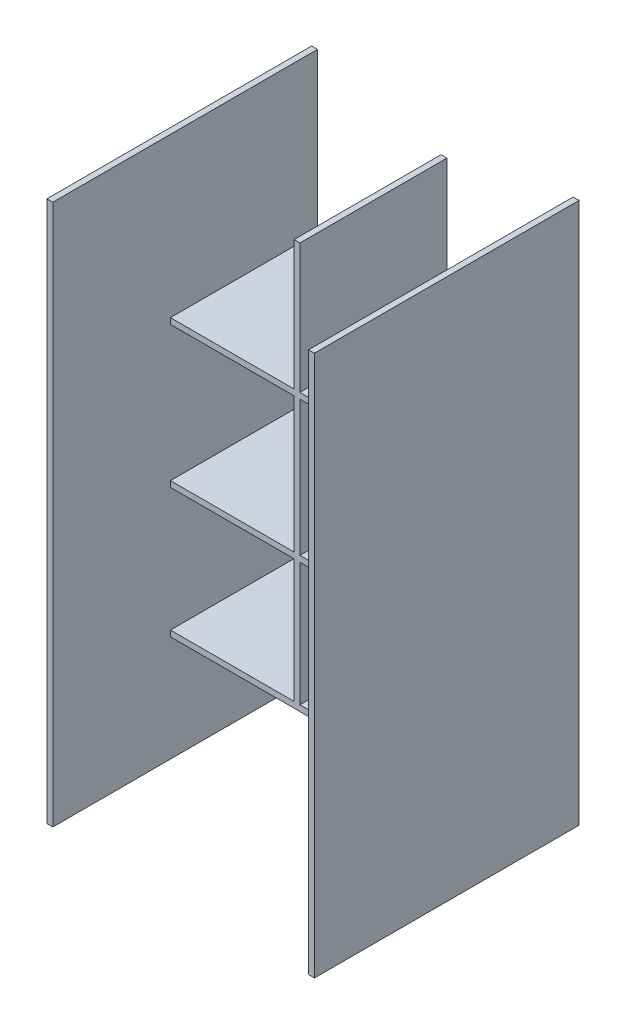
ISO-10303-21;
HEADER;
FILE_DESCRIPTION(('STEP AP214'),'2;1');
FILE_NAME('part.step','',(''),(''),'','','');
FILE_SCHEMA(('AUTOMOTIVE_DESIGN { 1 0 10303 214 1 1 1 1 }'));
ENDSEC;
DATA;
#1=APPLICATION_CONTEXT('core data for automotive mechanical design processes');
#2=APPLICATION_PROTOCOL_DEFINITION('international standard','automotive_design',2000,#1);
#3=PRODUCT_CONTEXT('',#1,'mechanical');
#4=PRODUCT('Part','Part','',(#3));
#5=PRODUCT_RELATED_PRODUCT_CATEGORY('part','',(#4));
#6=PRODUCT_DEFINITION_FORMATION('','',#4);
#7=PRODUCT_DEFINITION_CONTEXT('part definition',#1,'design');
#8=PRODUCT_DEFINITION('design','',#6,#7);
#9=PRODUCT_DEFINITION_SHAPE('','',#8);
#10=(LENGTH_UNIT() NAMED_UNIT(*) SI_UNIT(.MILLI.,.METRE.));
#11=(NAMED_UNIT(*) PLANE_ANGLE_UNIT() SI_UNIT($,.RADIAN.));
#12=(NAMED_UNIT(*) SI_UNIT($,.STERADIAN.) SOLID_ANGLE_UNIT());
#13=UNCERTAINTY_MEASURE_WITH_UNIT(LENGTH_MEASURE(1.E-05),#10,'distance_accuracy_value','');
#14=(GEOMETRIC_REPRESENTATION_CONTEXT(3) GLOBAL_UNCERTAINTY_ASSIGNED_CONTEXT((#13)) GLOBAL_UNIT_ASSIGNED_CONTEXT((#10,
#11,#12)) REPRESENTATION_CONTEXT('',''));
#15=CARTESIAN_POINT('',(0.,0.,0.));
#16=DIRECTION('',(0.,0.,1.));
#17=DIRECTION('',(1.,0.,0.));
#18=AXIS2_PLACEMENT_3D('',#15,#16,#17);
#19=CARTESIAN_POINT('',(250.,-345.,-350.));
#20=DIRECTION('',(0.,-1.,0.));
#21=DIRECTION('',(1.,0.,0.));
#22=AXIS2_PLACEMENT_3D('',#19,#20,#21);
#23=PLANE('',#22);
#24=DIRECTION('',(0.,0.,-1.));
#25=VECTOR('',#24,1.);
#26=CARTESIAN_POINT('',(219.654533205226,-345.,-350.));
#27=LINE('',#26,#25);
#28=CARTESIAN_POINT('',(219.654533205226,-345.,-100.));
#29=VERTEX_POINT('',#28);
#30=CARTESIAN_POINT('',(219.654533205226,-345.,-350.));
#31=VERTEX_POINT('',#30);
#32=EDGE_CURVE('E11',#29,#31,#27,.T.);
#33=ORIENTED_EDGE('',*,*,#32,.F.);
#34=DIRECTION('',(-1.,0.,0.));
#35=VECTOR('',#34,1.);
#36=CARTESIAN_POINT('',(250.,-345.,-100.));
#37=LINE('',#36,#35);
#38=CARTESIAN_POINT('',(-215.088836720033,-345.,-100.));
#39=VERTEX_POINT('',#38);
#40=EDGE_CURVE('E411',#29,#39,#37,.T.);
#41=ORIENTED_EDGE('',*,*,#40,.T.);
#42=DIRECTION('',(0.,0.,1.));
#43=VECTOR('',#42,1.);
#44=CARTESIAN_POINT('',(-215.088836720033,-345.,-350.));
#45=LINE('',#44,#43);
#46=CARTESIAN_POINT('',(-215.088836720033,-345.,-350.));
#47=VERTEX_POINT('',#46);
#48=EDGE_CURVE('E54',#47,#39,#45,.T.);
#49=ORIENTED_EDGE('',*,*,#48,.F.);
#50=DIRECTION('',(1.,0.,0.));
#51=VECTOR('',#50,1.);
#52=CARTESIAN_POINT('',(250.,-345.,-350.));
#53=LINE('',#52,#51);
#54=EDGE_CURVE('E501',#47,#31,#53,.T.);
#55=ORIENTED_EDGE('',*,*,#54,.T.);
#56=EDGE_LOOP('',(#33,#41,#49,#55));
#57=FACE_BOUND('',#56,.T.);
#58=ADVANCED_FACE('F41',(#57),#23,.T.);
#59=CARTESIAN_POINT('',(0.,0.,-350.));
#60=DIRECTION('',(0.,0.,1.));
#61=DIRECTION('',(1.,0.,0.));
#62=AXIS2_PLACEMENT_3D('',#59,#60,#61);
#63=PLANE('',#62);
#64=DIRECTION('',(1.,0.,0.));
#65=VECTOR('',#64,1.);
#66=CARTESIAN_POINT('',(-1.51806005407929E-13,-335.,-350.));
#67=LINE('',#66,#65);
#68=CARTESIAN_POINT('',(5.,-335.,-350.));
#69=VERTEX_POINT('',#68);
#70=CARTESIAN_POINT('',(219.654533205226,-335.,-350.));
#71=VERTEX_POINT('',#70);
#72=EDGE_CURVE('E435',#69,#71,#67,.T.);
#73=ORIENTED_EDGE('',*,*,#72,.T.);
#74=DIRECTION('',(0.,-1.,0.));
#75=VECTOR('',#74,1.);
#76=CARTESIAN_POINT('',(219.654533205226,0.,-350.));
#77=LINE('',#76,#75);
#78=CARTESIAN_POINT('',(219.654533205226,-125.,-350.));
#79=VERTEX_POINT('',#78);
#80=EDGE_CURVE('E341',#79,#71,#77,.T.);
#81=ORIENTED_EDGE('',*,*,#80,.F.);
#82=DIRECTION('',(1.,0.,0.));
#83=VECTOR('',#82,1.);
#84=CARTESIAN_POINT('',(0.,-125.,-350.));
#85=LINE('',#84,#83);
#86=CARTESIAN_POINT('',(5.00000000000001,-125.,-350.));
#87=VERTEX_POINT('',#86);
#88=EDGE_CURVE('E419',#87,#79,#85,.T.);
#89=ORIENTED_EDGE('',*,*,#88,.F.);
#90=DIRECTION('',(0.,1.,0.));
#91=VECTOR('',#90,1.);
#92=CARTESIAN_POINT('',(5.00000000000001,0.,-350.));
#93=LINE('',#92,#91);
#94=EDGE_CURVE('E427',#69,#87,#93,.T.);
#95=ORIENTED_EDGE('',*,*,#94,.F.);
#96=EDGE_LOOP('',(#73,#81,#89,#95));
#97=FACE_BOUND('',#96,.T.);
#98=DIRECTION('',(1.,0.,0.));
#99=VECTOR('',#98,1.);
#100=CARTESIAN_POINT('',(0.,-115.,-350.));
#101=LINE('',#100,#99);
#102=CARTESIAN_POINT('',(5.00000000000001,-115.,-350.));
#103=VERTEX_POINT('',#102);
#104=CARTESIAN_POINT('',(219.654533205226,-115.,-350.));
#105=VERTEX_POINT('',#104);
#106=EDGE_CURVE('E443',#103,#105,#101,.T.);
#107=ORIENTED_EDGE('',*,*,#106,.T.);
#108=DIRECTION('',(0.,-1.,0.));
#109=VECTOR('',#108,1.);
#110=CARTESIAN_POINT('',(219.654533205226,0.,-350.));
#111=LINE('',#110,#109);
#112=CARTESIAN_POINT('',(219.654533205226,115.,-350.));
#113=VERTEX_POINT('',#112);
#114=EDGE_CURVE('E337',#113,#105,#111,.T.);
#115=ORIENTED_EDGE('',*,*,#114,.F.);
#116=DIRECTION('',(1.,0.,0.));
#117=VECTOR('',#116,1.);
#118=CARTESIAN_POINT('',(0.,115.,-350.));
#119=LINE('',#118,#117);
#120=CARTESIAN_POINT('',(5.00000000000002,115.,-350.));
#121=VERTEX_POINT('',#120);
#122=EDGE_CURVE('E449',#121,#113,#119,.T.);
#123=ORIENTED_EDGE('',*,*,#122,.F.);
#124=DIRECTION('',(0.,1.,0.));
#125=VECTOR('',#124,1.);
#126=CARTESIAN_POINT('',(5.00000000000001,0.,-350.));
#127=LINE('',#126,#125);
#128=EDGE_CURVE('E445',#103,#121,#127,.T.);
#129=ORIENTED_EDGE('',*,*,#128,.F.);
#130=EDGE_LOOP('',(#107,#115,#123,#129));
#131=FACE_BOUND('',#130,.T.);
#132=DIRECTION('',(1.,0.,0.));
#133=VECTOR('',#132,1.);
#134=CARTESIAN_POINT('',(0.,115.,-350.));
#135=LINE('',#134,#133);
#136=CARTESIAN_POINT('',(-215.088836720033,115.,-350.));
#137=VERTEX_POINT('',#136);
#138=CARTESIAN_POINT('',(-4.99999999999999,115.,-350.));
#139=VERTEX_POINT('',#138);
#140=EDGE_CURVE('E488',#137,#139,#135,.T.);
#141=ORIENTED_EDGE('',*,*,#140,.F.);
#142=DIRECTION('',(0.,-1.,0.));
#143=VECTOR('',#142,1.);
#144=CARTESIAN_POINT('',(-215.088836720033,-115.,-350.));
#145=LINE('',#144,#143);
#146=CARTESIAN_POINT('',(-215.088836720033,-115.,-350.));
#147=VERTEX_POINT('',#146);
#148=EDGE_CURVE('E351',#137,#147,#145,.T.);
#149=ORIENTED_EDGE('',*,*,#148,.T.);
#150=DIRECTION('',(1.,0.,0.));
#151=VECTOR('',#150,1.);
#152=CARTESIAN_POINT('',(0.,-115.,-350.));
#153=LINE('',#152,#151);
#154=CARTESIAN_POINT('',(-5.,-115.,-350.));
#155=VERTEX_POINT('',#154);
#156=EDGE_CURVE('E453',#147,#155,#153,.T.);
#157=ORIENTED_EDGE('',*,*,#156,.T.);
#158=DIRECTION('',(0.,1.,0.));
#159=VECTOR('',#158,1.);
#160=CARTESIAN_POINT('',(-4.99999999999999,0.,-350.));
#161=LINE('',#160,#159);
#162=EDGE_CURVE('E483',#155,#139,#161,.T.);
#163=ORIENTED_EDGE('',*,*,#162,.T.);
#164=EDGE_LOOP('',(#141,#149,#157,#163));
#165=FACE_BOUND('',#164,.T.);
#166=DIRECTION('',(1.,0.,0.));
#167=VECTOR('',#166,1.);
#168=CARTESIAN_POINT('',(0.,-125.,-350.));
#169=LINE('',#168,#167);
#170=CARTESIAN_POINT('',(-215.088836720033,-125.,-350.));
#171=VERTEX_POINT('',#170);
#172=CARTESIAN_POINT('',(-5.,-125.,-350.));
#173=VERTEX_POINT('',#172);
#174=EDGE_CURVE('E465',#171,#173,#169,.T.);
#175=ORIENTED_EDGE('',*,*,#174,.F.);
#176=DIRECTION('',(0.,-1.,0.));
#177=VECTOR('',#176,1.);
#178=CARTESIAN_POINT('',(-215.088836720033,0.,-350.));
#179=LINE('',#178,#177);
#180=CARTESIAN_POINT('',(-215.088836720033,-335.,-350.));
#181=VERTEX_POINT('',#180);
#182=EDGE_CURVE('E346',#171,#181,#179,.T.);
#183=ORIENTED_EDGE('',*,*,#182,.T.);
#184=DIRECTION('',(1.,0.,0.));
#185=VECTOR('',#184,1.);
#186=CARTESIAN_POINT('',(1.5180600540793E-13,-335.,-350.));
#187=LINE('',#186,#185);
#188=CARTESIAN_POINT('',(-4.99999999999999,-335.,-350.));
#189=VERTEX_POINT('',#188);
#190=EDGE_CURVE('E437',#181,#189,#187,.T.);
#191=ORIENTED_EDGE('',*,*,#190,.T.);
#192=DIRECTION('',(0.,1.,0.));
#193=VECTOR('',#192,1.);
#194=CARTESIAN_POINT('',(-5.,0.,-350.));
#195=LINE('',#194,#193);
#196=EDGE_CURVE('E459',#189,#173,#195,.T.);
#197=ORIENTED_EDGE('',*,*,#196,.T.);
#198=EDGE_LOOP('',(#175,#183,#191,#197));
#199=FACE_BOUND('',#198,.T.);
#200=DIRECTION('',(0.,-1.,0.));
#201=VECTOR('',#200,1.);
#202=CARTESIAN_POINT('',(-215.088836720033,125.,-350.));
#203=LINE('',#202,#201);
#204=CARTESIAN_POINT('',(-215.088836720033,395.,-350.));
#205=VERTEX_POINT('',#204);
#206=CARTESIAN_POINT('',(-215.088836720033,125.,-350.));
#207=VERTEX_POINT('',#206);
#208=EDGE_CURVE('E329',#205,#207,#203,.T.);
#209=ORIENTED_EDGE('',*,*,#208,.T.);
#210=DIRECTION('',(1.,0.,0.));
#211=VECTOR('',#210,1.);
#212=CARTESIAN_POINT('',(0.,125.,-350.));
#213=LINE('',#212,#211);
#214=CARTESIAN_POINT('',(-4.99999999999999,125.,-350.));
#215=VERTEX_POINT('',#214);
#216=EDGE_CURVE('E479',#207,#215,#213,.T.);
#217=ORIENTED_EDGE('',*,*,#216,.T.);
#218=DIRECTION('',(0.,1.,0.));
#219=VECTOR('',#218,1.);
#220=CARTESIAN_POINT('',(-4.99999999999998,0.,-350.));
#221=LINE('',#220,#219);
#222=CARTESIAN_POINT('',(-5.,345.,-350.));
#223=VERTEX_POINT('',#222);
#224=EDGE_CURVE('E494',#215,#223,#221,.T.);
#225=ORIENTED_EDGE('',*,*,#224,.T.);
#226=DIRECTION('',(-1.,0.,0.));
#227=VECTOR('',#226,1.);
#228=CARTESIAN_POINT('',(250.,345.,-350.));
#229=LINE('',#228,#227);
#230=CARTESIAN_POINT('',(5.,345.,-350.));
#231=VERTEX_POINT('',#230);
#232=EDGE_CURVE('E504',#231,#223,#229,.T.);
#233=ORIENTED_EDGE('',*,*,#232,.F.);
#234=DIRECTION('',(0.,1.,0.));
#235=VECTOR('',#234,1.);
#236=CARTESIAN_POINT('',(5.00000000000003,0.,-350.));
#237=LINE('',#236,#235);
#238=CARTESIAN_POINT('',(5.00000000000002,125.,-350.));
#239=VERTEX_POINT('',#238);
#240=EDGE_CURVE('E469',#239,#231,#237,.T.);
#241=ORIENTED_EDGE('',*,*,#240,.F.);
#242=DIRECTION('',(1.,0.,0.));
#243=VECTOR('',#242,1.);
#244=CARTESIAN_POINT('',(0.,125.,-350.));
#245=LINE('',#244,#243);
#246=CARTESIAN_POINT('',(219.654533205226,125.,-350.));
#247=VERTEX_POINT('',#246);
#248=EDGE_CURVE('E472',#239,#247,#245,.T.);
#249=ORIENTED_EDGE('',*,*,#248,.T.);
#250=DIRECTION('',(0.,-1.,0.));
#251=VECTOR('',#250,1.);
#252=CARTESIAN_POINT('',(219.654533205226,-2.91269592349225E-13,-350.));
#253=LINE('',#252,#251);
#254=CARTESIAN_POINT('',(219.654533205226,395.,-350.));
#255=VERTEX_POINT('',#254);
#256=EDGE_CURVE('E368',#255,#247,#253,.T.);
#257=ORIENTED_EDGE('',*,*,#256,.F.);
#258=DIRECTION('',(1.,0.,0.));
#259=VECTOR('',#258,1.);
#260=CARTESIAN_POINT('',(229.654533205226,395.,-350.));
#261=LINE('',#260,#259);
#262=CARTESIAN_POINT('',(229.654533205226,395.,-350.));
#263=VERTEX_POINT('',#262);
#264=EDGE_CURVE('E306',#255,#263,#261,.T.);
#265=ORIENTED_EDGE('',*,*,#264,.T.);
#266=DIRECTION('',(0.,-1.,0.));
#267=VECTOR('',#266,1.);
#268=CARTESIAN_POINT('',(229.654533205226,0.,-350.));
#269=LINE('',#268,#267);
#270=CARTESIAN_POINT('',(229.654533205226,-525.,-350.));
#271=VERTEX_POINT('',#270);
#272=EDGE_CURVE('E344',#263,#271,#269,.T.);
#273=ORIENTED_EDGE('',*,*,#272,.T.);
#274=DIRECTION('',(-1.,0.,0.));
#275=VECTOR('',#274,1.);
#276=CARTESIAN_POINT('',(229.654533205226,-525.,-350.));
#277=LINE('',#276,#275);
#278=CARTESIAN_POINT('',(219.654533205226,-525.,-350.));
#279=VERTEX_POINT('',#278);
#280=EDGE_CURVE('E302',#271,#279,#277,.T.);
#281=ORIENTED_EDGE('',*,*,#280,.T.);
#282=DIRECTION('',(0.,1.,0.));
#283=VECTOR('',#282,1.);
#284=CARTESIAN_POINT('',(219.654533205226,395.,-350.));
#285=LINE('',#284,#283);
#286=EDGE_CURVE('E257',#279,#31,#285,.T.);
#287=ORIENTED_EDGE('',*,*,#286,.T.);
#288=ORIENTED_EDGE('',*,*,#54,.F.);
#289=DIRECTION('',(0.,-1.,0.));
#290=VECTOR('',#289,1.);
#291=CARTESIAN_POINT('',(-215.088836720033,395.,-350.));
#292=LINE('',#291,#290);
#293=CARTESIAN_POINT('',(-215.088836720033,-525.,-350.));
#294=VERTEX_POINT('',#293);
#295=EDGE_CURVE('E321',#47,#294,#292,.T.);
#296=ORIENTED_EDGE('',*,*,#295,.T.);
#297=DIRECTION('',(-1.,0.,0.));
#298=VECTOR('',#297,1.);
#299=CARTESIAN_POINT('',(-225.088836720033,-525.,-350.));
#300=LINE('',#299,#298);
#301=CARTESIAN_POINT('',(-225.088836720033,-525.,-350.));
#302=VERTEX_POINT('',#301);
#303=EDGE_CURVE('E322',#294,#302,#300,.T.);
#304=ORIENTED_EDGE('',*,*,#303,.T.);
#305=DIRECTION('',(0.,-1.,0.));
#306=VECTOR('',#305,1.);
#307=CARTESIAN_POINT('',(-225.088836720033,125.,-350.));
#308=LINE('',#307,#306);
#309=CARTESIAN_POINT('',(-225.088836720033,395.,-350.));
#310=VERTEX_POINT('',#309);
#311=EDGE_CURVE('E362',#310,#302,#308,.T.);
#312=ORIENTED_EDGE('',*,*,#311,.F.);
#313=DIRECTION('',(1.,0.,0.));
#314=VECTOR('',#313,1.);
#315=CARTESIAN_POINT('',(-225.088836720033,395.,-350.));
#316=LINE('',#315,#314);
#317=EDGE_CURVE('E281',#310,#205,#316,.T.);
#318=ORIENTED_EDGE('',*,*,#317,.T.);
#319=EDGE_LOOP('',(#209,#217,#225,#233,#241,#249,#257,#265,#273,#281,#287,#288,#296,#304,#312,#318));
#320=FACE_BOUND('',#319,.T.);
#321=CARTESIAN_POINT('',(0.,-330.,-350.));
#322=DIRECTION('',(0.,0.,-1.));
#323=DIRECTION('',(1.,0.,0.));
#324=AXIS2_PLACEMENT_3D('',#321,#322,#323);
#325=CIRCLE('',#324,2.5);
#326=CARTESIAN_POINT('',(2.5,-330.,-350.));
#327=VERTEX_POINT('',#326);
#328=EDGE_CURVE('E421',#327,#327,#325,.T.);
#329=ORIENTED_EDGE('',*,*,#328,.F.);
#330=EDGE_LOOP('',(#329));
#331=FACE_BOUND('',#330,.T.);
#332=CARTESIAN_POINT('',(0.,330.,-350.));
#333=DIRECTION('',(0.,0.,-1.));
#334=DIRECTION('',(-1.,0.,0.));
#335=AXIS2_PLACEMENT_3D('',#332,#333,#334);
#336=CIRCLE('',#335,2.5);
#337=CARTESIAN_POINT('',(-2.5,330.,-350.));
#338=VERTEX_POINT('',#337);
#339=EDGE_CURVE('E416',#338,#338,#336,.T.);
#340=ORIENTED_EDGE('',*,*,#339,.F.);
#341=EDGE_LOOP('',(#340));
#342=FACE_BOUND('',#341,.T.);
#343=ADVANCED_FACE('F523',(#97,#131,#165,#199,#320,#331,#342),#63,.F.);
#344=CARTESIAN_POINT('',(0.,0.,-100.));
#345=DIRECTION('',(0.,0.,1.));
#346=DIRECTION('',(1.,0.,0.));
#347=AXIS2_PLACEMENT_3D('',#344,#345,#346);
#348=PLANE('',#347);
#349=DIRECTION('',(0.,-1.,0.));
#350=VECTOR('',#349,1.);
#351=CARTESIAN_POINT('',(219.654533205226,395.,-100.));
#352=LINE('',#351,#350);
#353=CARTESIAN_POINT('',(219.654533205226,125.,-100.));
#354=VERTEX_POINT('',#353);
#355=CARTESIAN_POINT('',(219.654533205226,115.,-100.));
#356=VERTEX_POINT('',#355);
#357=EDGE_CURVE('E273',#354,#356,#352,.T.);
#358=ORIENTED_EDGE('',*,*,#357,.F.);
#359=DIRECTION('',(-1.,0.,0.));
#360=VECTOR('',#359,1.);
#361=CARTESIAN_POINT('',(0.,125.,-100.));
#362=LINE('',#361,#360);
#363=CARTESIAN_POINT('',(5.00000000000002,125.,-100.));
#364=VERTEX_POINT('',#363);
#365=EDGE_CURVE('E48',#354,#364,#362,.T.);
#366=ORIENTED_EDGE('',*,*,#365,.T.);
#367=DIRECTION('',(0.,-1.,0.));
#368=VECTOR('',#367,1.);
#369=CARTESIAN_POINT('',(5.00000000000003,0.,-100.));
#370=LINE('',#369,#368);
#371=CARTESIAN_POINT('',(5.,345.,-100.));
#372=VERTEX_POINT('',#371);
#373=EDGE_CURVE('E369',#372,#364,#370,.T.);
#374=ORIENTED_EDGE('',*,*,#373,.F.);
#375=DIRECTION('',(1.,0.,0.));
#376=VECTOR('',#375,1.);
#377=CARTESIAN_POINT('',(250.,345.,-100.));
#378=LINE('',#377,#376);
#379=CARTESIAN_POINT('',(-5.,345.,-100.));
#380=VERTEX_POINT('',#379);
#381=EDGE_CURVE('E374',#380,#372,#378,.T.);
#382=ORIENTED_EDGE('',*,*,#381,.F.);
#383=DIRECTION('',(0.,-1.,0.));
#384=VECTOR('',#383,1.);
#385=CARTESIAN_POINT('',(-4.99999999999998,0.,-100.));
#386=LINE('',#385,#384);
#387=CARTESIAN_POINT('',(-4.99999999999999,125.,-100.));
#388=VERTEX_POINT('',#387);
#389=EDGE_CURVE('E377',#380,#388,#386,.T.);
#390=ORIENTED_EDGE('',*,*,#389,.T.);
#391=DIRECTION('',(-1.,0.,0.));
#392=VECTOR('',#391,1.);
#393=CARTESIAN_POINT('',(0.,125.,-100.));
#394=LINE('',#393,#392);
#395=CARTESIAN_POINT('',(-215.088836720033,125.,-100.));
#396=VERTEX_POINT('',#395);
#397=EDGE_CURVE('E379',#388,#396,#394,.T.);
#398=ORIENTED_EDGE('',*,*,#397,.T.);
#399=DIRECTION('',(0.,1.,0.));
#400=VECTOR('',#399,1.);
#401=CARTESIAN_POINT('',(-215.088836720033,395.,-100.));
#402=LINE('',#401,#400);
#403=CARTESIAN_POINT('',(-215.088836720033,115.,-100.));
#404=VERTEX_POINT('',#403);
#405=EDGE_CURVE('E290',#404,#396,#402,.T.);
#406=ORIENTED_EDGE('',*,*,#405,.F.);
#407=DIRECTION('',(-1.,0.,0.));
#408=VECTOR('',#407,1.);
#409=CARTESIAN_POINT('',(0.,115.,-100.));
#410=LINE('',#409,#408);
#411=CARTESIAN_POINT('',(-4.99999999999999,115.,-100.));
#412=VERTEX_POINT('',#411);
#413=EDGE_CURVE('E401',#412,#404,#410,.T.);
#414=ORIENTED_EDGE('',*,*,#413,.F.);
#415=DIRECTION('',(0.,-1.,0.));
#416=VECTOR('',#415,1.);
#417=CARTESIAN_POINT('',(-4.99999999999999,0.,-100.));
#418=LINE('',#417,#416);
#419=CARTESIAN_POINT('',(-5.,-115.,-100.));
#420=VERTEX_POINT('',#419);
#421=EDGE_CURVE('E402',#412,#420,#418,.T.);
#422=ORIENTED_EDGE('',*,*,#421,.T.);
#423=DIRECTION('',(-1.,0.,0.));
#424=VECTOR('',#423,1.);
#425=CARTESIAN_POINT('',(0.,-115.,-100.));
#426=LINE('',#425,#424);
#427=CARTESIAN_POINT('',(-215.088836720033,-115.,-100.));
#428=VERTEX_POINT('',#427);
#429=EDGE_CURVE('E398',#420,#428,#426,.T.);
#430=ORIENTED_EDGE('',*,*,#429,.T.);
#431=CARTESIAN_POINT('',(-215.088836720033,-125.,-100.));
#432=VERTEX_POINT('',#431);
#433=EDGE_CURVE('E286',#432,#428,#402,.T.);
#434=ORIENTED_EDGE('',*,*,#433,.F.);
#435=DIRECTION('',(-1.,0.,0.));
#436=VECTOR('',#435,1.);
#437=CARTESIAN_POINT('',(0.,-125.,-100.));
#438=LINE('',#437,#436);
#439=CARTESIAN_POINT('',(-5.,-125.,-100.));
#440=VERTEX_POINT('',#439);
#441=EDGE_CURVE('E389',#440,#432,#438,.T.);
#442=ORIENTED_EDGE('',*,*,#441,.F.);
#443=DIRECTION('',(0.,-1.,0.));
#444=VECTOR('',#443,1.);
#445=CARTESIAN_POINT('',(-5.,0.,-100.));
#446=LINE('',#445,#444);
#447=CARTESIAN_POINT('',(-4.99999999999999,-335.,-100.));
#448=VERTEX_POINT('',#447);
#449=EDGE_CURVE('E387',#440,#448,#446,.T.);
#450=ORIENTED_EDGE('',*,*,#449,.T.);
#451=DIRECTION('',(-1.,0.,0.));
#452=VECTOR('',#451,1.);
#453=CARTESIAN_POINT('',(1.5180600540793E-13,-335.,-100.));
#454=LINE('',#453,#452);
#455=CARTESIAN_POINT('',(-215.088836720033,-335.,-100.));
#456=VERTEX_POINT('',#455);
#457=EDGE_CURVE('E384',#448,#456,#454,.T.);
#458=ORIENTED_EDGE('',*,*,#457,.T.);
#459=EDGE_CURVE('E287',#39,#456,#402,.T.);
#460=ORIENTED_EDGE('',*,*,#459,.F.);
#461=ORIENTED_EDGE('',*,*,#40,.F.);
#462=CARTESIAN_POINT('',(219.654533205226,-335.,-100.));
#463=VERTEX_POINT('',#462);
#464=EDGE_CURVE('E278',#463,#29,#352,.T.);
#465=ORIENTED_EDGE('',*,*,#464,.F.);
#466=DIRECTION('',(-1.,0.,0.));
#467=VECTOR('',#466,1.);
#468=CARTESIAN_POINT('',(-1.51806005407929E-13,-335.,-100.));
#469=LINE('',#468,#467);
#470=CARTESIAN_POINT('',(5.,-335.,-100.));
#471=VERTEX_POINT('',#470);
#472=EDGE_CURVE('E406',#463,#471,#469,.T.);
#473=ORIENTED_EDGE('',*,*,#472,.T.);
#474=DIRECTION('',(0.,-1.,0.));
#475=VECTOR('',#474,1.);
#476=CARTESIAN_POINT('',(5.00000000000001,0.,-100.));
#477=LINE('',#476,#475);
#478=CARTESIAN_POINT('',(5.00000000000001,-125.,-100.));
#479=VERTEX_POINT('',#478);
#480=EDGE_CURVE('E407',#479,#471,#477,.T.);
#481=ORIENTED_EDGE('',*,*,#480,.F.);
#482=DIRECTION('',(-1.,0.,0.));
#483=VECTOR('',#482,1.);
#484=CARTESIAN_POINT('',(0.,-125.,-100.));
#485=LINE('',#484,#483);
#486=CARTESIAN_POINT('',(219.654533205226,-125.,-100.));
#487=VERTEX_POINT('',#486);
#488=EDGE_CURVE('E413',#487,#479,#485,.T.);
#489=ORIENTED_EDGE('',*,*,#488,.F.);
#490=CARTESIAN_POINT('',(219.654533205226,-115.,-100.));
#491=VERTEX_POINT('',#490);
#492=EDGE_CURVE('E279',#491,#487,#352,.T.);
#493=ORIENTED_EDGE('',*,*,#492,.F.);
#494=DIRECTION('',(-1.,0.,0.));
#495=VECTOR('',#494,1.);
#496=CARTESIAN_POINT('',(0.,-115.,-100.));
#497=LINE('',#496,#495);
#498=CARTESIAN_POINT('',(5.00000000000001,-115.,-100.));
#499=VERTEX_POINT('',#498);
#500=EDGE_CURVE('E393',#491,#499,#497,.T.);
#501=ORIENTED_EDGE('',*,*,#500,.T.);
#502=DIRECTION('',(0.,-1.,0.));
#503=VECTOR('',#502,1.);
#504=CARTESIAN_POINT('',(5.00000000000001,0.,-100.));
#505=LINE('',#504,#503);
#506=CARTESIAN_POINT('',(5.00000000000002,115.,-100.));
#507=VERTEX_POINT('',#506);
#508=EDGE_CURVE('E391',#507,#499,#505,.T.);
#509=ORIENTED_EDGE('',*,*,#508,.F.);
#510=DIRECTION('',(-1.,0.,0.));
#511=VECTOR('',#510,1.);
#512=CARTESIAN_POINT('',(0.,115.,-100.));
#513=LINE('',#512,#511);
#514=EDGE_CURVE('E397',#356,#507,#513,.T.);
#515=ORIENTED_EDGE('',*,*,#514,.F.);
#516=EDGE_LOOP('',(#358,#366,#374,#382,#390,#398,#406,#414,#422,#430,#434,#442,#450,#458,#460,
#461,#465,#473,#481,#489,#493,#501,#509,#515));
#517=FACE_BOUND('',#516,.T.);
#518=ADVANCED_FACE('F508',(#517),#348,.T.);
#519=CARTESIAN_POINT('',(0.,-125.,-350.));
#520=DIRECTION('',(0.,-1.,0.));
#521=DIRECTION('',(1.,0.,0.));
#522=AXIS2_PLACEMENT_3D('',#519,#520,#521);
#523=PLANE('',#522);
#524=ORIENTED_EDGE('',*,*,#88,.T.);
#525=DIRECTION('',(0.,0.,1.));
#526=VECTOR('',#525,1.);
#527=CARTESIAN_POINT('',(219.654533205226,-125.,-580.217288664427));
#528=LINE('',#527,#526);
#529=EDGE_CURVE('E342',#79,#487,#528,.T.);
#530=ORIENTED_EDGE('',*,*,#529,.T.);
#531=ORIENTED_EDGE('',*,*,#488,.T.);
#532=DIRECTION('',(0.,0.,1.));
#533=VECTOR('',#532,1.);
#534=CARTESIAN_POINT('',(5.00000000000001,-125.,-350.));
#535=LINE('',#534,#533);
#536=EDGE_CURVE('E434',#87,#479,#535,.T.);
#537=ORIENTED_EDGE('',*,*,#536,.F.);
#538=EDGE_LOOP('',(#524,#530,#531,#537));
#539=FACE_BOUND('',#538,.T.);
#540=ADVANCED_FACE('F570',(#539),#523,.T.);
#541=CARTESIAN_POINT('',(-1.51806005407929E-13,-335.,-350.));
#542=DIRECTION('',(0.,-1.,0.));
#543=DIRECTION('',(1.,0.,0.));
#544=AXIS2_PLACEMENT_3D('',#541,#542,#543);
#545=PLANE('',#544);
#546=DIRECTION('',(0.,0.,1.));
#547=VECTOR('',#546,1.);
#548=CARTESIAN_POINT('',(219.654533205226,-335.,-580.217288664427));
#549=LINE('',#548,#547);
#550=EDGE_CURVE('E336',#71,#463,#549,.T.);
#551=ORIENTED_EDGE('',*,*,#550,.F.);
#552=ORIENTED_EDGE('',*,*,#72,.F.);
#553=DIRECTION('',(0.,0.,1.));
#554=VECTOR('',#553,1.);
#555=CARTESIAN_POINT('',(5.,-335.,-350.));
#556=LINE('',#555,#554);
#557=EDGE_CURVE('E436',#69,#471,#556,.T.);
#558=ORIENTED_EDGE('',*,*,#557,.T.);
#559=ORIENTED_EDGE('',*,*,#472,.F.);
#560=EDGE_LOOP('',(#551,#552,#558,#559));
#561=FACE_BOUND('',#560,.T.);
#562=ADVANCED_FACE('F620',(#561),#545,.F.);
#563=CARTESIAN_POINT('',(0.,115.,-350.));
#564=DIRECTION('',(0.,-1.,0.));
#565=DIRECTION('',(1.,0.,0.));
#566=AXIS2_PLACEMENT_3D('',#563,#564,#565);
#567=PLANE('',#566);
#568=ORIENTED_EDGE('',*,*,#122,.T.);
#569=DIRECTION('',(0.,0.,1.));
#570=VECTOR('',#569,1.);
#571=CARTESIAN_POINT('',(219.654533205226,115.,-580.217288664427));
#572=LINE('',#571,#570);
#573=EDGE_CURVE('E334',#113,#356,#572,.T.);
#574=ORIENTED_EDGE('',*,*,#573,.T.);
#575=ORIENTED_EDGE('',*,*,#514,.T.);
#576=DIRECTION('',(0.,0.,1.));
#577=VECTOR('',#576,1.);
#578=CARTESIAN_POINT('',(5.00000000000002,115.,-350.));
#579=LINE('',#578,#577);
#580=EDGE_CURVE('E455',#121,#507,#579,.T.);
#581=ORIENTED_EDGE('',*,*,#580,.F.);
#582=EDGE_LOOP('',(#568,#574,#575,#581));
#583=FACE_BOUND('',#582,.T.);
#584=ADVANCED_FACE('F590',(#583),#567,.T.);
#585=CARTESIAN_POINT('',(0.,-115.,-350.));
#586=DIRECTION('',(0.,-1.,0.));
#587=DIRECTION('',(1.,0.,0.));
#588=AXIS2_PLACEMENT_3D('',#585,#586,#587);
#589=PLANE('',#588);
#590=DIRECTION('',(0.,0.,1.));
#591=VECTOR('',#590,1.);
#592=CARTESIAN_POINT('',(219.654533205226,-115.,-580.217288664427));
#593=LINE('',#592,#591);
#594=EDGE_CURVE('E327',#105,#491,#593,.T.);
#595=ORIENTED_EDGE('',*,*,#594,.F.);
#596=ORIENTED_EDGE('',*,*,#106,.F.);
#597=DIRECTION('',(0.,0.,1.));
#598=VECTOR('',#597,1.);
#599=CARTESIAN_POINT('',(5.00000000000001,-115.,-350.));
#600=LINE('',#599,#598);
#601=EDGE_CURVE('E452',#103,#499,#600,.T.);
#602=ORIENTED_EDGE('',*,*,#601,.T.);
#603=ORIENTED_EDGE('',*,*,#500,.F.);
#604=EDGE_LOOP('',(#595,#596,#602,#603));
#605=FACE_BOUND('',#604,.T.);
#606=ADVANCED_FACE('F582',(#605),#589,.F.);
#607=CARTESIAN_POINT('',(0.,125.,-350.));
#608=DIRECTION('',(0.,-1.,0.));
#609=DIRECTION('',(1.,0.,0.));
#610=AXIS2_PLACEMENT_3D('',#607,#608,#609);
#611=PLANE('',#610);
#612=DIRECTION('',(0.,0.,1.));
#613=VECTOR('',#612,1.);
#614=CARTESIAN_POINT('',(219.654533205226,125.,-580.217288664427));
#615=LINE('',#614,#613);
#616=EDGE_CURVE('E333',#247,#354,#615,.T.);
#617=ORIENTED_EDGE('',*,*,#616,.F.);
#618=ORIENTED_EDGE('',*,*,#248,.F.);
#619=DIRECTION('',(0.,0.,1.));
#620=VECTOR('',#619,1.);
#621=CARTESIAN_POINT('',(5.00000000000002,125.,-350.));
#622=LINE('',#621,#620);
#623=EDGE_CURVE('E473',#239,#364,#622,.T.);
#624=ORIENTED_EDGE('',*,*,#623,.T.);
#625=ORIENTED_EDGE('',*,*,#365,.F.);
#626=EDGE_LOOP('',(#617,#618,#624,#625));
#627=FACE_BOUND('',#626,.T.);
#628=ADVANCED_FACE('F520',(#627),#611,.F.);
#629=CARTESIAN_POINT('',(250.,345.,-350.));
#630=DIRECTION('',(0.,1.,0.));
#631=DIRECTION('',(-1.,0.,0.));
#632=AXIS2_PLACEMENT_3D('',#629,#630,#631);
#633=PLANE('',#632);
#634=DIRECTION('',(0.,0.,1.));
#635=VECTOR('',#634,1.);
#636=CARTESIAN_POINT('',(-5.,345.,-350.));
#637=LINE('',#636,#635);
#638=EDGE_CURVE('E498',#223,#380,#637,.T.);
#639=ORIENTED_EDGE('',*,*,#638,.T.);
#640=ORIENTED_EDGE('',*,*,#381,.T.);
#641=DIRECTION('',(0.,0.,1.));
#642=VECTOR('',#641,1.);
#643=CARTESIAN_POINT('',(5.,345.,-350.));
#644=LINE('',#643,#642);
#645=EDGE_CURVE('E478',#231,#372,#644,.T.);
#646=ORIENTED_EDGE('',*,*,#645,.F.);
#647=ORIENTED_EDGE('',*,*,#232,.T.);
#648=EDGE_LOOP('',(#639,#640,#646,#647));
#649=FACE_BOUND('',#648,.T.);
#650=ADVANCED_FACE('F524',(#649),#633,.T.);
#651=CARTESIAN_POINT('',(5.00000000000001,0.,-350.));
#652=DIRECTION('',(1.,0.,0.));
#653=DIRECTION('',(0.,1.,0.));
#654=AXIS2_PLACEMENT_3D('',#651,#652,#653);
#655=PLANE('',#654);
#656=ORIENTED_EDGE('',*,*,#536,.T.);
#657=ORIENTED_EDGE('',*,*,#480,.T.);
#658=ORIENTED_EDGE('',*,*,#557,.F.);
#659=ORIENTED_EDGE('',*,*,#94,.T.);
#660=EDGE_LOOP('',(#656,#657,#658,#659));
#661=FACE_BOUND('',#660,.T.);
#662=ADVANCED_FACE('F572',(#661),#655,.T.);
#663=CARTESIAN_POINT('',(-4.99999999999999,0.,-350.));
#664=DIRECTION('',(1.,0.,0.));
#665=DIRECTION('',(0.,1.,0.));
#666=AXIS2_PLACEMENT_3D('',#663,#664,#665);
#667=PLANE('',#666);
#668=ORIENTED_EDGE('',*,*,#421,.F.);
#669=DIRECTION('',(0.,0.,1.));
#670=VECTOR('',#669,1.);
#671=CARTESIAN_POINT('',(-4.99999999999999,115.,-350.));
#672=LINE('',#671,#670);
#673=EDGE_CURVE('E475',#139,#412,#672,.T.);
#674=ORIENTED_EDGE('',*,*,#673,.F.);
#675=ORIENTED_EDGE('',*,*,#162,.F.);
#676=DIRECTION('',(0.,0.,1.));
#677=VECTOR('',#676,1.);
#678=CARTESIAN_POINT('',(-5.,-115.,-350.));
#679=LINE('',#678,#677);
#680=EDGE_CURVE('E486',#155,#420,#679,.T.);
#681=ORIENTED_EDGE('',*,*,#680,.T.);
#682=EDGE_LOOP('',(#668,#674,#675,#681));
#683=FACE_BOUND('',#682,.T.);
#684=ADVANCED_FACE('F542',(#683),#667,.F.);
#685=CARTESIAN_POINT('',(5.00000000000001,0.,-350.));
#686=DIRECTION('',(1.,0.,0.));
#687=DIRECTION('',(0.,1.,0.));
#688=AXIS2_PLACEMENT_3D('',#685,#686,#687);
#689=PLANE('',#688);
#690=ORIENTED_EDGE('',*,*,#580,.T.);
#691=ORIENTED_EDGE('',*,*,#508,.T.);
#692=ORIENTED_EDGE('',*,*,#601,.F.);
#693=ORIENTED_EDGE('',*,*,#128,.T.);
#694=EDGE_LOOP('',(#690,#691,#692,#693));
#695=FACE_BOUND('',#694,.T.);
#696=ADVANCED_FACE('F596',(#695),#689,.T.);
#697=CARTESIAN_POINT('',(-5.,0.,-350.));
#698=DIRECTION('',(1.,0.,0.));
#699=DIRECTION('',(0.,1.,0.));
#700=AXIS2_PLACEMENT_3D('',#697,#698,#699);
#701=PLANE('',#700);
#702=ORIENTED_EDGE('',*,*,#449,.F.);
#703=DIRECTION('',(0.,0.,1.));
#704=VECTOR('',#703,1.);
#705=CARTESIAN_POINT('',(-5.,-125.,-350.));
#706=LINE('',#705,#704);
#707=EDGE_CURVE('E444',#173,#440,#706,.T.);
#708=ORIENTED_EDGE('',*,*,#707,.F.);
#709=ORIENTED_EDGE('',*,*,#196,.F.);
#710=DIRECTION('',(0.,0.,1.));
#711=VECTOR('',#710,1.);
#712=CARTESIAN_POINT('',(-4.99999999999999,-335.,-350.));
#713=LINE('',#712,#711);
#714=EDGE_CURVE('E464',#189,#448,#713,.T.);
#715=ORIENTED_EDGE('',*,*,#714,.T.);
#716=EDGE_LOOP('',(#702,#708,#709,#715));
#717=FACE_BOUND('',#716,.T.);
#718=ADVANCED_FACE('F605',(#717),#701,.F.);
#719=CARTESIAN_POINT('',(-4.99999999999998,0.,-350.));
#720=DIRECTION('',(1.,0.,0.));
#721=DIRECTION('',(0.,1.,0.));
#722=AXIS2_PLACEMENT_3D('',#719,#720,#721);
#723=PLANE('',#722);
#724=ORIENTED_EDGE('',*,*,#389,.F.);
#725=ORIENTED_EDGE('',*,*,#638,.F.);
#726=ORIENTED_EDGE('',*,*,#224,.F.);
#727=DIRECTION('',(0.,0.,1.));
#728=VECTOR('',#727,1.);
#729=CARTESIAN_POINT('',(-4.99999999999999,125.,-350.));
#730=LINE('',#729,#728);
#731=EDGE_CURVE('E500',#215,#388,#730,.T.);
#732=ORIENTED_EDGE('',*,*,#731,.T.);
#733=EDGE_LOOP('',(#724,#725,#726,#732));
#734=FACE_BOUND('',#733,.T.);
#735=ADVANCED_FACE('F528',(#734),#723,.F.);
#736=CARTESIAN_POINT('',(5.00000000000003,0.,-350.));
#737=DIRECTION('',(1.,0.,0.));
#738=DIRECTION('',(0.,1.,0.));
#739=AXIS2_PLACEMENT_3D('',#736,#737,#738);
#740=PLANE('',#739);
#741=ORIENTED_EDGE('',*,*,#645,.T.);
#742=ORIENTED_EDGE('',*,*,#373,.T.);
#743=ORIENTED_EDGE('',*,*,#623,.F.);
#744=ORIENTED_EDGE('',*,*,#240,.T.);
#745=EDGE_LOOP('',(#741,#742,#743,#744));
#746=FACE_BOUND('',#745,.T.);
#747=ADVANCED_FACE('F511',(#746),#740,.T.);
#748=CARTESIAN_POINT('',(0.,115.,-350.));
#749=DIRECTION('',(0.,-1.,0.));
#750=DIRECTION('',(1.,0.,0.));
#751=AXIS2_PLACEMENT_3D('',#748,#749,#750);
#752=PLANE('',#751);
#753=DIRECTION('',(0.,0.,1.));
#754=VECTOR('',#753,1.);
#755=CARTESIAN_POINT('',(-215.088836720033,115.,-580.217288664427));
#756=LINE('',#755,#754);
#757=EDGE_CURVE('E356',#137,#404,#756,.T.);
#758=ORIENTED_EDGE('',*,*,#757,.F.);
#759=ORIENTED_EDGE('',*,*,#140,.T.);
#760=ORIENTED_EDGE('',*,*,#673,.T.);
#761=ORIENTED_EDGE('',*,*,#413,.T.);
#762=EDGE_LOOP('',(#758,#759,#760,#761));
#763=FACE_BOUND('',#762,.T.);
#764=ADVANCED_FACE('F538',(#763),#752,.T.);
#765=CARTESIAN_POINT('',(0.,-115.,-350.));
#766=DIRECTION('',(0.,-1.,0.));
#767=DIRECTION('',(1.,0.,0.));
#768=AXIS2_PLACEMENT_3D('',#765,#766,#767);
#769=PLANE('',#768);
#770=ORIENTED_EDGE('',*,*,#156,.F.);
#771=DIRECTION('',(0.,0.,1.));
#772=VECTOR('',#771,1.);
#773=CARTESIAN_POINT('',(-215.088836720033,-115.,-580.217288664427));
#774=LINE('',#773,#772);
#775=EDGE_CURVE('E352',#147,#428,#774,.T.);
#776=ORIENTED_EDGE('',*,*,#775,.T.);
#777=ORIENTED_EDGE('',*,*,#429,.F.);
#778=ORIENTED_EDGE('',*,*,#680,.F.);
#779=EDGE_LOOP('',(#770,#776,#777,#778));
#780=FACE_BOUND('',#779,.T.);
#781=ADVANCED_FACE('F549',(#780),#769,.F.);
#782=CARTESIAN_POINT('',(0.,-125.,-350.));
#783=DIRECTION('',(0.,-1.,0.));
#784=DIRECTION('',(1.,0.,0.));
#785=AXIS2_PLACEMENT_3D('',#782,#783,#784);
#786=PLANE('',#785);
#787=DIRECTION('',(0.,0.,1.));
#788=VECTOR('',#787,1.);
#789=CARTESIAN_POINT('',(-215.088836720033,-125.,-580.217288664427));
#790=LINE('',#789,#788);
#791=EDGE_CURVE('E347',#171,#432,#790,.T.);
#792=ORIENTED_EDGE('',*,*,#791,.F.);
#793=ORIENTED_EDGE('',*,*,#174,.T.);
#794=ORIENTED_EDGE('',*,*,#707,.T.);
#795=ORIENTED_EDGE('',*,*,#441,.T.);
#796=EDGE_LOOP('',(#792,#793,#794,#795));
#797=FACE_BOUND('',#796,.T.);
#798=ADVANCED_FACE('F598',(#797),#786,.T.);
#799=CARTESIAN_POINT('',(1.5180600540793E-13,-335.,-350.));
#800=DIRECTION('',(0.,-1.,0.));
#801=DIRECTION('',(1.,0.,0.));
#802=AXIS2_PLACEMENT_3D('',#799,#800,#801);
#803=PLANE('',#802);
#804=ORIENTED_EDGE('',*,*,#190,.F.);
#805=DIRECTION('',(0.,0.,1.));
#806=VECTOR('',#805,1.);
#807=CARTESIAN_POINT('',(-215.088836720033,-335.,-580.217288664427));
#808=LINE('',#807,#806);
#809=EDGE_CURVE('E348',#181,#456,#808,.T.);
#810=ORIENTED_EDGE('',*,*,#809,.T.);
#811=ORIENTED_EDGE('',*,*,#457,.F.);
#812=ORIENTED_EDGE('',*,*,#714,.F.);
#813=EDGE_LOOP('',(#804,#810,#811,#812));
#814=FACE_BOUND('',#813,.T.);
#815=ADVANCED_FACE('F595',(#814),#803,.F.);
#816=CARTESIAN_POINT('',(0.,125.,-350.));
#817=DIRECTION('',(0.,-1.,0.));
#818=DIRECTION('',(1.,0.,0.));
#819=AXIS2_PLACEMENT_3D('',#816,#817,#818);
#820=PLANE('',#819);
#821=ORIENTED_EDGE('',*,*,#216,.F.);
#822=DIRECTION('',(0.,0.,1.));
#823=VECTOR('',#822,1.);
#824=CARTESIAN_POINT('',(-215.088836720033,125.,-580.217288664427));
#825=LINE('',#824,#823);
#826=EDGE_CURVE('E360',#207,#396,#825,.T.);
#827=ORIENTED_EDGE('',*,*,#826,.T.);
#828=ORIENTED_EDGE('',*,*,#397,.F.);
#829=ORIENTED_EDGE('',*,*,#731,.F.);
#830=EDGE_LOOP('',(#821,#827,#828,#829));
#831=FACE_BOUND('',#830,.T.);
#832=ADVANCED_FACE('F535',(#831),#820,.F.);
#833=CARTESIAN_POINT('',(0.,-330.,-340.));
#834=DIRECTION('',(0.,0.,-1.));
#835=DIRECTION('',(-1.,0.,0.));
#836=AXIS2_PLACEMENT_3D('',#833,#834,#835);
#837=CYLINDRICAL_SURFACE('',#836,2.5);
#838=CARTESIAN_POINT('',(0.,-330.,-340.));
#839=DIRECTION('',(0.,0.,-1.));
#840=DIRECTION('',(1.,0.,0.));
#841=AXIS2_PLACEMENT_3D('',#838,#839,#840);
#842=CIRCLE('',#841,2.5);
#843=CARTESIAN_POINT('',(2.5,-330.,-340.));
#844=VERTEX_POINT('',#843);
#845=EDGE_CURVE('E412',#844,#844,#842,.T.);
#846=ORIENTED_EDGE('',*,*,#845,.F.);
#847=EDGE_LOOP('',(#846));
#848=FACE_BOUND('',#847,.T.);
#849=ORIENTED_EDGE('',*,*,#328,.T.);
#850=EDGE_LOOP('',(#849));
#851=FACE_BOUND('',#850,.T.);
#852=ADVANCED_FACE('F631',(#848,#851),#837,.F.);
#853=CARTESIAN_POINT('',(0.,-330.,-340.));
#854=DIRECTION('',(0.,0.,1.));
#855=DIRECTION('',(1.,0.,0.));
#856=AXIS2_PLACEMENT_3D('',#853,#854,#855);
#857=PLANE('',#856);
#858=ORIENTED_EDGE('',*,*,#845,.T.);
#859=EDGE_LOOP('',(#858));
#860=FACE_BOUND('',#859,.T.);
#861=ADVANCED_FACE('F630',(#860),#857,.F.);
#862=CARTESIAN_POINT('',(0.,330.,-340.));
#863=DIRECTION('',(0.,0.,-1.));
#864=DIRECTION('',(-1.,0.,0.));
#865=AXIS2_PLACEMENT_3D('',#862,#863,#864);
#866=CYLINDRICAL_SURFACE('',#865,2.5);
#867=CARTESIAN_POINT('',(0.,330.,-340.));
#868=DIRECTION('',(0.,0.,-1.));
#869=DIRECTION('',(-1.,0.,0.));
#870=AXIS2_PLACEMENT_3D('',#867,#868,#869);
#871=CIRCLE('',#870,2.5);
#872=CARTESIAN_POINT('',(-2.5,330.,-340.));
#873=VERTEX_POINT('',#872);
#874=EDGE_CURVE('E417',#873,#873,#871,.T.);
#875=ORIENTED_EDGE('',*,*,#874,.F.);
#876=EDGE_LOOP('',(#875));
#877=FACE_BOUND('',#876,.T.);
#878=ORIENTED_EDGE('',*,*,#339,.T.);
#879=EDGE_LOOP('',(#878));
#880=FACE_BOUND('',#879,.T.);
#881=ADVANCED_FACE('F629',(#877,#880),#866,.F.);
#882=CARTESIAN_POINT('',(0.,330.,-340.));
#883=DIRECTION('',(0.,0.,-1.));
#884=DIRECTION('',(-1.,0.,0.));
#885=AXIS2_PLACEMENT_3D('',#882,#883,#884);
#886=PLANE('',#885);
#887=ORIENTED_EDGE('',*,*,#874,.T.);
#888=EDGE_LOOP('',(#887));
#889=FACE_BOUND('',#888,.T.);
#890=ADVANCED_FACE('F637',(#889),#886,.T.);
#891=CARTESIAN_POINT('',(-225.088836720033,125.,-580.217288664427));
#892=DIRECTION('',(1.,0.,0.));
#893=DIRECTION('',(0.,0.,-1.));
#894=AXIS2_PLACEMENT_3D('',#891,#892,#893);
#895=PLANE('',#894);
#896=DIRECTION('',(0.,0.,1.));
#897=VECTOR('',#896,1.);
#898=CARTESIAN_POINT('',(-225.088836720033,-525.,-1270.05434622092));
#899=LINE('',#898,#897);
#900=CARTESIAN_POINT('',(-225.088836720033,-525.,100.));
#901=VERTEX_POINT('',#900);
#902=EDGE_CURVE('E314',#302,#901,#899,.T.);
#903=ORIENTED_EDGE('',*,*,#902,.T.);
#904=DIRECTION('',(0.,-1.,0.));
#905=VECTOR('',#904,1.);
#906=CARTESIAN_POINT('',(-225.088836720033,395.,100.));
#907=LINE('',#906,#905);
#908=CARTESIAN_POINT('',(-225.088836720033,395.,100.));
#909=VERTEX_POINT('',#908);
#910=EDGE_CURVE('E293',#909,#901,#907,.T.);
#911=ORIENTED_EDGE('',*,*,#910,.F.);
#912=DIRECTION('',(0.,0.,1.));
#913=VECTOR('',#912,1.);
#914=CARTESIAN_POINT('',(-225.088836720033,395.,-1270.05434622092));
#915=LINE('',#914,#913);
#916=EDGE_CURVE('E311',#310,#909,#915,.T.);
#917=ORIENTED_EDGE('',*,*,#916,.F.);
#918=ORIENTED_EDGE('',*,*,#311,.T.);
#919=EDGE_LOOP('',(#903,#911,#917,#918));
#920=FACE_BOUND('',#919,.T.);
#921=ADVANCED_FACE('F639',(#920),#895,.F.);
#922=CARTESIAN_POINT('',(-215.088836720033,125.,-580.217288664427));
#923=DIRECTION('',(1.,0.,0.));
#924=DIRECTION('',(0.,0.,-1.));
#925=AXIS2_PLACEMENT_3D('',#922,#923,#924);
#926=PLANE('',#925);
#927=ORIENTED_EDGE('',*,*,#208,.F.);
#928=DIRECTION('',(0.,0.,1.));
#929=VECTOR('',#928,1.);
#930=CARTESIAN_POINT('',(-215.088836720033,395.,-1270.05434622092));
#931=LINE('',#930,#929);
#932=CARTESIAN_POINT('',(-215.088836720033,395.,100.));
#933=VERTEX_POINT('',#932);
#934=EDGE_CURVE('E316',#205,#933,#931,.T.);
#935=ORIENTED_EDGE('',*,*,#934,.T.);
#936=DIRECTION('',(0.,1.,0.));
#937=VECTOR('',#936,1.);
#938=CARTESIAN_POINT('',(-215.088836720033,395.,100.));
#939=LINE('',#938,#937);
#940=CARTESIAN_POINT('',(-215.088836720033,-525.,100.));
#941=VERTEX_POINT('',#940);
#942=EDGE_CURVE('E294',#941,#933,#939,.T.);
#943=ORIENTED_EDGE('',*,*,#942,.F.);
#944=DIRECTION('',(0.,0.,1.));
#945=VECTOR('',#944,1.);
#946=CARTESIAN_POINT('',(-215.088836720033,-525.,-1270.05434622092));
#947=LINE('',#946,#945);
#948=EDGE_CURVE('E320',#294,#941,#947,.T.);
#949=ORIENTED_EDGE('',*,*,#948,.F.);
#950=ORIENTED_EDGE('',*,*,#295,.F.);
#951=ORIENTED_EDGE('',*,*,#48,.T.);
#952=ORIENTED_EDGE('',*,*,#459,.T.);
#953=ORIENTED_EDGE('',*,*,#809,.F.);
#954=ORIENTED_EDGE('',*,*,#182,.F.);
#955=ORIENTED_EDGE('',*,*,#791,.T.);
#956=ORIENTED_EDGE('',*,*,#433,.T.);
#957=ORIENTED_EDGE('',*,*,#775,.F.);
#958=ORIENTED_EDGE('',*,*,#148,.F.);
#959=ORIENTED_EDGE('',*,*,#757,.T.);
#960=ORIENTED_EDGE('',*,*,#405,.T.);
#961=ORIENTED_EDGE('',*,*,#826,.F.);
#962=EDGE_LOOP('',(#927,#935,#943,#949,#950,#951,#952,#953,#954,#955,#956,#957,#958,#959,#960,#961));
#963=FACE_BOUND('',#962,.T.);
#964=ADVANCED_FACE('F533',(#963),#926,.T.);
#965=CARTESIAN_POINT('',(229.654533205226,0.,-580.217288664427));
#966=DIRECTION('',(1.,0.,0.));
#967=DIRECTION('',(0.,0.,-1.));
#968=AXIS2_PLACEMENT_3D('',#965,#966,#967);
#969=PLANE('',#968);
#970=ORIENTED_EDGE('',*,*,#272,.F.);
#971=DIRECTION('',(0.,0.,1.));
#972=VECTOR('',#971,1.);
#973=CARTESIAN_POINT('',(229.654533205226,395.,-1270.05434622092));
#974=LINE('',#973,#972);
#975=CARTESIAN_POINT('',(229.654533205226,395.,100.));
#976=VERTEX_POINT('',#975);
#977=EDGE_CURVE('E307',#263,#976,#974,.T.);
#978=ORIENTED_EDGE('',*,*,#977,.T.);
#979=DIRECTION('',(0.,1.,0.));
#980=VECTOR('',#979,1.);
#981=CARTESIAN_POINT('',(229.654533205226,395.,100.));
#982=LINE('',#981,#980);
#983=CARTESIAN_POINT('',(229.654533205226,-525.,100.));
#984=VERTEX_POINT('',#983);
#985=EDGE_CURVE('E269',#984,#976,#982,.T.);
#986=ORIENTED_EDGE('',*,*,#985,.F.);
#987=DIRECTION('',(0.,0.,1.));
#988=VECTOR('',#987,1.);
#989=CARTESIAN_POINT('',(229.654533205226,-525.,-1270.05434622092));
#990=LINE('',#989,#988);
#991=EDGE_CURVE('E256',#271,#984,#990,.T.);
#992=ORIENTED_EDGE('',*,*,#991,.F.);
#993=EDGE_LOOP('',(#970,#978,#986,#992));
#994=FACE_BOUND('',#993,.T.);
#995=ADVANCED_FACE('F649',(#994),#969,.T.);
#996=CARTESIAN_POINT('',(219.654533205226,0.,-580.217288664427));
#997=DIRECTION('',(1.,0.,0.));
#998=DIRECTION('',(0.,0.,-1.));
#999=AXIS2_PLACEMENT_3D('',#996,#997,#998);
#1000=PLANE('',#999);
#1001=ORIENTED_EDGE('',*,*,#529,.F.);
#1002=ORIENTED_EDGE('',*,*,#80,.T.);
#1003=ORIENTED_EDGE('',*,*,#550,.T.);
#1004=ORIENTED_EDGE('',*,*,#464,.T.);
#1005=ORIENTED_EDGE('',*,*,#32,.T.);
#1006=ORIENTED_EDGE('',*,*,#286,.F.);
#1007=DIRECTION('',(0.,0.,1.));
#1008=VECTOR('',#1007,1.);
#1009=CARTESIAN_POINT('',(219.654533205226,-525.,-1270.05434622092));
#1010=LINE('',#1009,#1008);
#1011=CARTESIAN_POINT('',(219.654533205226,-525.,100.));
#1012=VERTEX_POINT('',#1011);
#1013=EDGE_CURVE('E247',#279,#1012,#1010,.T.);
#1014=ORIENTED_EDGE('',*,*,#1013,.T.);
#1015=DIRECTION('',(0.,-1.,0.));
#1016=VECTOR('',#1015,1.);
#1017=CARTESIAN_POINT('',(219.654533205226,395.,100.));
#1018=LINE('',#1017,#1016);
#1019=CARTESIAN_POINT('',(219.654533205226,395.,100.));
#1020=VERTEX_POINT('',#1019);
#1021=EDGE_CURVE('E251',#1020,#1012,#1018,.T.);
#1022=ORIENTED_EDGE('',*,*,#1021,.F.);
#1023=DIRECTION('',(0.,0.,1.));
#1024=VECTOR('',#1023,1.);
#1025=CARTESIAN_POINT('',(219.654533205226,395.,-1270.05434622092));
#1026=LINE('',#1025,#1024);
#1027=EDGE_CURVE('E258',#255,#1020,#1026,.T.);
#1028=ORIENTED_EDGE('',*,*,#1027,.F.);
#1029=ORIENTED_EDGE('',*,*,#256,.T.);
#1030=ORIENTED_EDGE('',*,*,#616,.T.);
#1031=ORIENTED_EDGE('',*,*,#357,.T.);
#1032=ORIENTED_EDGE('',*,*,#573,.F.);
#1033=ORIENTED_EDGE('',*,*,#114,.T.);
#1034=ORIENTED_EDGE('',*,*,#594,.T.);
#1035=ORIENTED_EDGE('',*,*,#492,.T.);
#1036=EDGE_LOOP('',(#1001,#1002,#1003,#1004,#1005,#1006,#1014,#1022,#1028,#1029,#1030,#1031,
#1032,#1033,#1034,#1035));
#1037=FACE_BOUND('',#1036,.T.);
#1038=ADVANCED_FACE('F252',(#1037),#1000,.F.);
#1039=CARTESIAN_POINT('',(-225.088836720033,-525.,-1270.05434622092));
#1040=DIRECTION('',(0.,-1.,0.));
#1041=DIRECTION('',(0.,0.,-1.));
#1042=AXIS2_PLACEMENT_3D('',#1039,#1040,#1041);
#1043=PLANE('',#1042);
#1044=ORIENTED_EDGE('',*,*,#303,.F.);
#1045=ORIENTED_EDGE('',*,*,#948,.T.);
#1046=DIRECTION('',(1.,0.,0.));
#1047=VECTOR('',#1046,1.);
#1048=CARTESIAN_POINT('',(-225.088836720033,-525.,100.));
#1049=LINE('',#1048,#1047);
#1050=EDGE_CURVE('E296',#901,#941,#1049,.T.);
#1051=ORIENTED_EDGE('',*,*,#1050,.F.);
#1052=ORIENTED_EDGE('',*,*,#902,.F.);
#1053=EDGE_LOOP('',(#1044,#1045,#1051,#1052));
#1054=FACE_BOUND('',#1053,.T.);
#1055=ADVANCED_FACE('F654',(#1054),#1043,.T.);
#1056=CARTESIAN_POINT('',(229.654533205226,-525.,-1270.05434622092));
#1057=DIRECTION('',(0.,-1.,0.));
#1058=DIRECTION('',(0.,0.,-1.));
#1059=AXIS2_PLACEMENT_3D('',#1056,#1057,#1058);
#1060=PLANE('',#1059);
#1061=ORIENTED_EDGE('',*,*,#280,.F.);
#1062=ORIENTED_EDGE('',*,*,#991,.T.);
#1063=DIRECTION('',(1.,0.,0.));
#1064=VECTOR('',#1063,1.);
#1065=CARTESIAN_POINT('',(219.654533205226,-525.,100.));
#1066=LINE('',#1065,#1064);
#1067=EDGE_CURVE('E261',#1012,#984,#1066,.T.);
#1068=ORIENTED_EDGE('',*,*,#1067,.F.);
#1069=ORIENTED_EDGE('',*,*,#1013,.F.);
#1070=EDGE_LOOP('',(#1061,#1062,#1068,#1069));
#1071=FACE_BOUND('',#1070,.T.);
#1072=ADVANCED_FACE('F264',(#1071),#1060,.T.);
#1073=CARTESIAN_POINT('',(229.654533205226,395.,-1270.05434622092));
#1074=DIRECTION('',(0.,1.,0.));
#1075=DIRECTION('',(0.,0.,1.));
#1076=AXIS2_PLACEMENT_3D('',#1073,#1074,#1075);
#1077=PLANE('',#1076);
#1078=ORIENTED_EDGE('',*,*,#264,.F.);
#1079=ORIENTED_EDGE('',*,*,#1027,.T.);
#1080=DIRECTION('',(-1.,0.,0.));
#1081=VECTOR('',#1080,1.);
#1082=CARTESIAN_POINT('',(219.654533205226,395.,100.));
#1083=LINE('',#1082,#1081);
#1084=EDGE_CURVE('E274',#976,#1020,#1083,.T.);
#1085=ORIENTED_EDGE('',*,*,#1084,.F.);
#1086=ORIENTED_EDGE('',*,*,#977,.F.);
#1087=EDGE_LOOP('',(#1078,#1079,#1085,#1086));
#1088=FACE_BOUND('',#1087,.T.);
#1089=ADVANCED_FACE('F665',(#1088),#1077,.T.);
#1090=CARTESIAN_POINT('',(-225.088836720033,395.,-1270.05434622092));
#1091=DIRECTION('',(0.,1.,0.));
#1092=DIRECTION('',(0.,0.,1.));
#1093=AXIS2_PLACEMENT_3D('',#1090,#1091,#1092);
#1094=PLANE('',#1093);
#1095=ORIENTED_EDGE('',*,*,#317,.F.);
#1096=ORIENTED_EDGE('',*,*,#916,.T.);
#1097=DIRECTION('',(-1.,0.,0.));
#1098=VECTOR('',#1097,1.);
#1099=CARTESIAN_POINT('',(-225.088836720033,395.,100.));
#1100=LINE('',#1099,#1098);
#1101=EDGE_CURVE('E292',#933,#909,#1100,.T.);
#1102=ORIENTED_EDGE('',*,*,#1101,.F.);
#1103=ORIENTED_EDGE('',*,*,#934,.F.);
#1104=EDGE_LOOP('',(#1095,#1096,#1102,#1103));
#1105=FACE_BOUND('',#1104,.T.);
#1106=ADVANCED_FACE('F658',(#1105),#1094,.T.);
#1107=CARTESIAN_POINT('',(0.,0.,100.));
#1108=DIRECTION('',(0.,0.,1.));
#1109=DIRECTION('',(1.,0.,0.));
#1110=AXIS2_PLACEMENT_3D('',#1107,#1108,#1109);
#1111=PLANE('',#1110);
#1112=ORIENTED_EDGE('',*,*,#910,.T.);
#1113=ORIENTED_EDGE('',*,*,#1050,.T.);
#1114=ORIENTED_EDGE('',*,*,#942,.T.);
#1115=ORIENTED_EDGE('',*,*,#1101,.T.);
#1116=EDGE_LOOP('',(#1112,#1113,#1114,#1115));
#1117=FACE_BOUND('',#1116,.T.);
#1118=ADVANCED_FACE('F662',(#1117),#1111,.T.);
#1119=CARTESIAN_POINT('',(0.,0.,100.));
#1120=DIRECTION('',(0.,0.,1.));
#1121=DIRECTION('',(1.,0.,0.));
#1122=AXIS2_PLACEMENT_3D('',#1119,#1120,#1121);
#1123=PLANE('',#1122);
#1124=ORIENTED_EDGE('',*,*,#1021,.T.);
#1125=ORIENTED_EDGE('',*,*,#1067,.T.);
#1126=ORIENTED_EDGE('',*,*,#985,.T.);
#1127=ORIENTED_EDGE('',*,*,#1084,.T.);
#1128=EDGE_LOOP('',(#1124,#1125,#1126,#1127));
#1129=FACE_BOUND('',#1128,.T.);
#1130=ADVANCED_FACE('F275',(#1129),#1123,.T.);
#1131=CLOSED_SHELL('',(#58,#343,#518,#540,#562,#584,#606,#628,#650,#662,#684,#696,#718,#735,
#747,#764,#781,#798,#815,#832,#852,#861,#881,#890,#921,#964,#995,#1038,#1055,#1072,#1089,#1106,
#1118,#1130));
#1132=MANIFOLD_SOLID_BREP('B2',#1131);
#1133=ADVANCED_BREP_SHAPE_REPRESENTATION('',(#18,#1132),#14);
#1134=SHAPE_DEFINITION_REPRESENTATION(#9,#1133);
ENDSEC;
END-ISO-10303-21;
